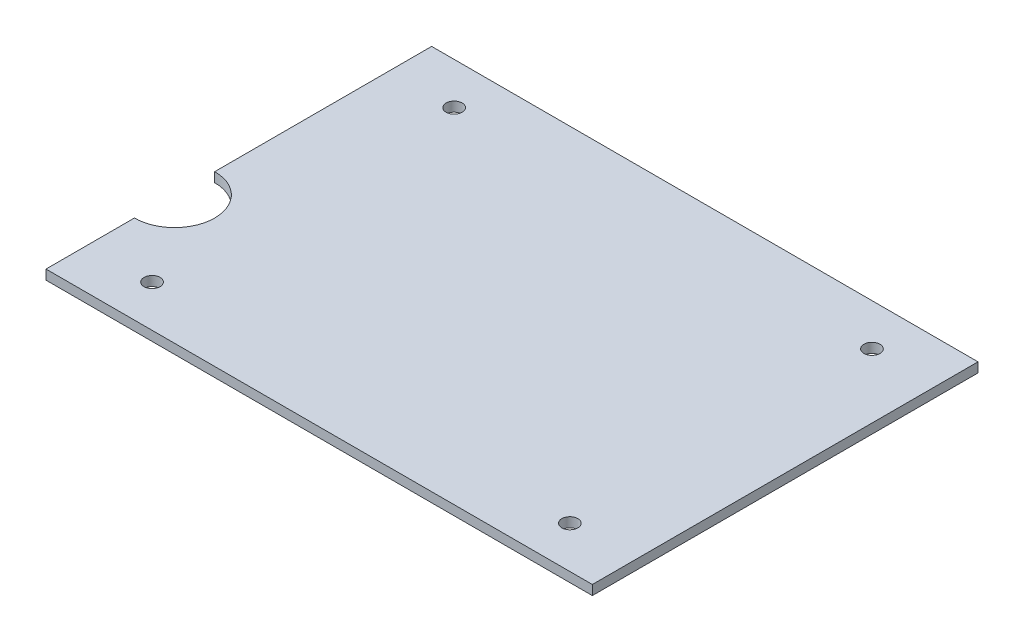
ISO-10303-21;
HEADER;
FILE_DESCRIPTION(('STEP AP214'),'2;1');
FILE_NAME('part.step','',(''),(''),'','','');
FILE_SCHEMA(('AUTOMOTIVE_DESIGN { 1 0 10303 214 1 1 1 1 }'));
ENDSEC;
DATA;
#1=APPLICATION_CONTEXT('core data for automotive mechanical design processes');
#2=APPLICATION_PROTOCOL_DEFINITION('international standard','automotive_design',2000,#1);
#3=PRODUCT_CONTEXT('',#1,'mechanical');
#4=PRODUCT('Part','Part','',(#3));
#5=PRODUCT_RELATED_PRODUCT_CATEGORY('part','',(#4));
#6=PRODUCT_DEFINITION_FORMATION('','',#4);
#7=PRODUCT_DEFINITION_CONTEXT('part definition',#1,'design');
#8=PRODUCT_DEFINITION('design','',#6,#7);
#9=PRODUCT_DEFINITION_SHAPE('','',#8);
#10=(LENGTH_UNIT() NAMED_UNIT(*) SI_UNIT(.MILLI.,.METRE.));
#11=(NAMED_UNIT(*) PLANE_ANGLE_UNIT() SI_UNIT($,.RADIAN.));
#12=(NAMED_UNIT(*) SI_UNIT($,.STERADIAN.) SOLID_ANGLE_UNIT());
#13=UNCERTAINTY_MEASURE_WITH_UNIT(LENGTH_MEASURE(1.E-05),#10,'distance_accuracy_value','');
#14=(GEOMETRIC_REPRESENTATION_CONTEXT(3) GLOBAL_UNCERTAINTY_ASSIGNED_CONTEXT((#13)) GLOBAL_UNIT_ASSIGNED_CONTEXT((#10,
#11,#12)) REPRESENTATION_CONTEXT('',''));
#15=CARTESIAN_POINT('',(0.,0.,0.));
#16=DIRECTION('',(0.,0.,1.));
#17=DIRECTION('',(1.,0.,0.));
#18=AXIS2_PLACEMENT_3D('',#15,#16,#17);
#19=CARTESIAN_POINT('',(-85.,3.,60.));
#20=DIRECTION('',(1.,0.,0.));
#21=DIRECTION('',(0.,0.,-1.));
#22=AXIS2_PLACEMENT_3D('',#19,#20,#21);
#23=PLANE('',#22);
#24=DIRECTION('',(0.,0.,1.));
#25=VECTOR('',#24,1.);
#26=CARTESIAN_POINT('',(-85.,0.,60.));
#27=LINE('',#26,#25);
#28=CARTESIAN_POINT('',(-85.,0.,-60.));
#29=VERTEX_POINT('',#28);
#30=CARTESIAN_POINT('',(-85.,0.,7.49999999999988));
#31=VERTEX_POINT('',#30);
#32=EDGE_CURVE('E107',#29,#31,#27,.T.);
#33=ORIENTED_EDGE('',*,*,#32,.T.);
#34=DIRECTION('',(0.,1.,0.));
#35=VECTOR('',#34,1.);
#36=CARTESIAN_POINT('',(-85.,-0.00100000000000013,7.49999999999989));
#37=LINE('',#36,#35);
#38=CARTESIAN_POINT('',(-85.,3.,7.49999999999988));
#39=VERTEX_POINT('',#38);
#40=EDGE_CURVE('E96',#39,#31,#37,.F.);
#41=ORIENTED_EDGE('',*,*,#40,.F.);
#42=DIRECTION('',(0.,0.,1.));
#43=VECTOR('',#42,1.);
#44=CARTESIAN_POINT('',(-85.,3.,60.));
#45=LINE('',#44,#43);
#46=CARTESIAN_POINT('',(-85.,3.,-60.));
#47=VERTEX_POINT('',#46);
#48=EDGE_CURVE('E105',#47,#39,#45,.T.);
#49=ORIENTED_EDGE('',*,*,#48,.F.);
#50=DIRECTION('',(0.,-1.,0.));
#51=VECTOR('',#50,1.);
#52=CARTESIAN_POINT('',(-85.,3.,-60.));
#53=LINE('',#52,#51);
#54=EDGE_CURVE('E41',#47,#29,#53,.T.);
#55=ORIENTED_EDGE('',*,*,#54,.T.);
#56=EDGE_LOOP('',(#33,#41,#49,#55));
#57=FACE_BOUND('',#56,.T.);
#58=ADVANCED_FACE('F33',(#57),#23,.F.);
#59=CARTESIAN_POINT('',(0.,3.,0.));
#60=DIRECTION('',(0.,-1.,0.));
#61=DIRECTION('',(0.,0.,-1.));
#62=AXIS2_PLACEMENT_3D('',#59,#60,#61);
#63=PLANE('',#62);
#64=ORIENTED_EDGE('',*,*,#48,.T.);
#65=CARTESIAN_POINT('',(-85.,3.,19.9999999999999));
#66=DIRECTION('',(0.,1.,0.));
#67=DIRECTION('',(0.,0.,1.));
#68=AXIS2_PLACEMENT_3D('',#65,#66,#67);
#69=CIRCLE('',#68,12.5);
#70=CARTESIAN_POINT('',(-85.,3.,32.4999999999999));
#71=VERTEX_POINT('',#70);
#72=EDGE_CURVE('E93',#71,#39,#69,.T.);
#73=ORIENTED_EDGE('',*,*,#72,.F.);
#74=CARTESIAN_POINT('',(-85.,3.,60.));
#75=VERTEX_POINT('',#74);
#76=EDGE_CURVE('E111',#71,#75,#45,.T.);
#77=ORIENTED_EDGE('',*,*,#76,.T.);
#78=DIRECTION('',(1.,0.,0.));
#79=VECTOR('',#78,1.);
#80=CARTESIAN_POINT('',(-85.,3.,60.));
#81=LINE('',#80,#79);
#82=CARTESIAN_POINT('',(85.,3.,60.));
#83=VERTEX_POINT('',#82);
#84=EDGE_CURVE('E57',#75,#83,#81,.T.);
#85=ORIENTED_EDGE('',*,*,#84,.T.);
#86=DIRECTION('',(0.,0.,-1.));
#87=VECTOR('',#86,1.);
#88=CARTESIAN_POINT('',(85.,3.,60.));
#89=LINE('',#88,#87);
#90=CARTESIAN_POINT('',(85.,3.,-60.));
#91=VERTEX_POINT('',#90);
#92=EDGE_CURVE('E127',#83,#91,#89,.T.);
#93=ORIENTED_EDGE('',*,*,#92,.T.);
#94=DIRECTION('',(-1.,0.,0.));
#95=VECTOR('',#94,1.);
#96=CARTESIAN_POINT('',(-85.,3.,-60.));
#97=LINE('',#96,#95);
#98=EDGE_CURVE('E85',#91,#47,#97,.T.);
#99=ORIENTED_EDGE('',*,*,#98,.T.);
#100=EDGE_LOOP('',(#64,#73,#77,#85,#93,#99));
#101=FACE_BOUND('',#100,.T.);
#102=CARTESIAN_POINT('',(-65.,3.,-47.));
#103=DIRECTION('',(0.,1.,0.));
#104=DIRECTION('',(0.,0.,1.));
#105=AXIS2_PLACEMENT_3D('',#102,#103,#104);
#106=CIRCLE('',#105,2.5);
#107=CARTESIAN_POINT('',(-65.,3.,-44.5));
#108=VERTEX_POINT('',#107);
#109=EDGE_CURVE('E122',#108,#108,#106,.T.);
#110=ORIENTED_EDGE('',*,*,#109,.F.);
#111=EDGE_LOOP('',(#110));
#112=FACE_BOUND('',#111,.T.);
#113=CARTESIAN_POINT('',(-65.,3.,47.));
#114=DIRECTION('',(0.,1.,0.));
#115=DIRECTION('',(0.,0.,-1.));
#116=AXIS2_PLACEMENT_3D('',#113,#114,#115);
#117=CIRCLE('',#116,2.5);
#118=CARTESIAN_POINT('',(-65.,3.,44.5));
#119=VERTEX_POINT('',#118);
#120=EDGE_CURVE('E150',#119,#119,#117,.T.);
#121=ORIENTED_EDGE('',*,*,#120,.F.);
#122=EDGE_LOOP('',(#121));
#123=FACE_BOUND('',#122,.T.);
#124=CARTESIAN_POINT('',(65.,3.,47.));
#125=DIRECTION('',(0.,1.,0.));
#126=DIRECTION('',(0.,0.,1.));
#127=AXIS2_PLACEMENT_3D('',#124,#125,#126);
#128=CIRCLE('',#127,2.5);
#129=CARTESIAN_POINT('',(65.,3.,49.5));
#130=VERTEX_POINT('',#129);
#131=EDGE_CURVE('E144',#130,#130,#128,.T.);
#132=ORIENTED_EDGE('',*,*,#131,.F.);
#133=EDGE_LOOP('',(#132));
#134=FACE_BOUND('',#133,.T.);
#135=CARTESIAN_POINT('',(65.,3.,-47.));
#136=DIRECTION('',(0.,1.,0.));
#137=DIRECTION('',(0.,0.,-1.));
#138=AXIS2_PLACEMENT_3D('',#135,#136,#137);
#139=CIRCLE('',#138,2.5);
#140=CARTESIAN_POINT('',(65.,3.,-49.5));
#141=VERTEX_POINT('',#140);
#142=EDGE_CURVE('E138',#141,#141,#139,.T.);
#143=ORIENTED_EDGE('',*,*,#142,.F.);
#144=EDGE_LOOP('',(#143));
#145=FACE_BOUND('',#144,.T.);
#146=ADVANCED_FACE('F109',(#101,#112,#123,#134,#145),#63,.F.);
#147=CARTESIAN_POINT('',(0.,0.,0.));
#148=DIRECTION('',(0.,-1.,0.));
#149=DIRECTION('',(0.,0.,-1.));
#150=AXIS2_PLACEMENT_3D('',#147,#148,#149);
#151=PLANE('',#150);
#152=CARTESIAN_POINT('',(-85.,0.,19.9999999999999));
#153=DIRECTION('',(0.,-1.,0.));
#154=DIRECTION('',(0.,0.,-1.));
#155=AXIS2_PLACEMENT_3D('',#152,#153,#154);
#156=CIRCLE('',#155,12.5);
#157=CARTESIAN_POINT('',(-85.,0.,32.4999999999999));
#158=VERTEX_POINT('',#157);
#159=EDGE_CURVE('E48',#158,#31,#156,.F.);
#160=ORIENTED_EDGE('',*,*,#159,.T.);
#161=ORIENTED_EDGE('',*,*,#32,.F.);
#162=DIRECTION('',(-1.,0.,0.));
#163=VECTOR('',#162,1.);
#164=CARTESIAN_POINT('',(-85.,0.,-60.));
#165=LINE('',#164,#163);
#166=CARTESIAN_POINT('',(85.,0.,-60.));
#167=VERTEX_POINT('',#166);
#168=EDGE_CURVE('E121',#167,#29,#165,.T.);
#169=ORIENTED_EDGE('',*,*,#168,.F.);
#170=DIRECTION('',(0.,0.,-1.));
#171=VECTOR('',#170,1.);
#172=CARTESIAN_POINT('',(85.,0.,60.));
#173=LINE('',#172,#171);
#174=CARTESIAN_POINT('',(85.,0.,60.));
#175=VERTEX_POINT('',#174);
#176=EDGE_CURVE('E118',#175,#167,#173,.T.);
#177=ORIENTED_EDGE('',*,*,#176,.F.);
#178=DIRECTION('',(1.,0.,0.));
#179=VECTOR('',#178,1.);
#180=CARTESIAN_POINT('',(-85.,0.,60.));
#181=LINE('',#180,#179);
#182=CARTESIAN_POINT('',(-85.,0.,60.));
#183=VERTEX_POINT('',#182);
#184=EDGE_CURVE('E78',#183,#175,#181,.T.);
#185=ORIENTED_EDGE('',*,*,#184,.F.);
#186=EDGE_CURVE('E124',#158,#183,#27,.T.);
#187=ORIENTED_EDGE('',*,*,#186,.F.);
#188=EDGE_LOOP('',(#160,#161,#169,#177,#185,#187));
#189=FACE_BOUND('',#188,.T.);
#190=CARTESIAN_POINT('',(65.,0.,47.));
#191=DIRECTION('',(0.,1.,0.));
#192=DIRECTION('',(0.,0.,1.));
#193=AXIS2_PLACEMENT_3D('',#190,#191,#192);
#194=CIRCLE('',#193,2.5);
#195=CARTESIAN_POINT('',(65.,0.,49.5));
#196=VERTEX_POINT('',#195);
#197=EDGE_CURVE('E142',#196,#196,#194,.T.);
#198=ORIENTED_EDGE('',*,*,#197,.T.);
#199=EDGE_LOOP('',(#198));
#200=FACE_BOUND('',#199,.T.);
#201=CARTESIAN_POINT('',(-65.,0.,-47.));
#202=DIRECTION('',(0.,1.,0.));
#203=DIRECTION('',(0.,0.,1.));
#204=AXIS2_PLACEMENT_3D('',#201,#202,#203);
#205=CIRCLE('',#204,2.5);
#206=CARTESIAN_POINT('',(-65.,0.,-44.5));
#207=VERTEX_POINT('',#206);
#208=EDGE_CURVE('E153',#207,#207,#205,.T.);
#209=ORIENTED_EDGE('',*,*,#208,.T.);
#210=EDGE_LOOP('',(#209));
#211=FACE_BOUND('',#210,.T.);
#212=CARTESIAN_POINT('',(-65.,0.,47.));
#213=DIRECTION('',(0.,1.,0.));
#214=DIRECTION('',(0.,0.,-1.));
#215=AXIS2_PLACEMENT_3D('',#212,#213,#214);
#216=CIRCLE('',#215,2.5);
#217=CARTESIAN_POINT('',(-65.,0.,44.5));
#218=VERTEX_POINT('',#217);
#219=EDGE_CURVE('E147',#218,#218,#216,.T.);
#220=ORIENTED_EDGE('',*,*,#219,.T.);
#221=EDGE_LOOP('',(#220));
#222=FACE_BOUND('',#221,.T.);
#223=CARTESIAN_POINT('',(65.,0.,-47.));
#224=DIRECTION('',(0.,1.,0.));
#225=DIRECTION('',(0.,0.,-1.));
#226=AXIS2_PLACEMENT_3D('',#223,#224,#225);
#227=CIRCLE('',#226,2.5);
#228=CARTESIAN_POINT('',(65.,0.,-49.5));
#229=VERTEX_POINT('',#228);
#230=EDGE_CURVE('E135',#229,#229,#227,.T.);
#231=ORIENTED_EDGE('',*,*,#230,.T.);
#232=EDGE_LOOP('',(#231));
#233=FACE_BOUND('',#232,.T.);
#234=ADVANCED_FACE('F131',(#189,#200,#211,#222,#233),#151,.T.);
#235=CARTESIAN_POINT('',(85.,3.,60.));
#236=DIRECTION('',(-1.,0.,0.));
#237=DIRECTION('',(0.,0.,1.));
#238=AXIS2_PLACEMENT_3D('',#235,#236,#237);
#239=PLANE('',#238);
#240=ORIENTED_EDGE('',*,*,#176,.T.);
#241=DIRECTION('',(0.,-1.,0.));
#242=VECTOR('',#241,1.);
#243=CARTESIAN_POINT('',(85.,3.,-60.));
#244=LINE('',#243,#242);
#245=EDGE_CURVE('E11',#91,#167,#244,.T.);
#246=ORIENTED_EDGE('',*,*,#245,.F.);
#247=ORIENTED_EDGE('',*,*,#92,.F.);
#248=DIRECTION('',(0.,-1.,0.));
#249=VECTOR('',#248,1.);
#250=CARTESIAN_POINT('',(85.,3.,60.));
#251=LINE('',#250,#249);
#252=EDGE_CURVE('E113',#83,#175,#251,.T.);
#253=ORIENTED_EDGE('',*,*,#252,.T.);
#254=EDGE_LOOP('',(#240,#246,#247,#253));
#255=FACE_BOUND('',#254,.T.);
#256=ADVANCED_FACE('F35',(#255),#239,.F.);
#257=CARTESIAN_POINT('',(-85.,3.,-60.));
#258=DIRECTION('',(0.,0.,1.));
#259=DIRECTION('',(1.,0.,0.));
#260=AXIS2_PLACEMENT_3D('',#257,#258,#259);
#261=PLANE('',#260);
#262=ORIENTED_EDGE('',*,*,#168,.T.);
#263=ORIENTED_EDGE('',*,*,#54,.F.);
#264=ORIENTED_EDGE('',*,*,#98,.F.);
#265=ORIENTED_EDGE('',*,*,#245,.T.);
#266=EDGE_LOOP('',(#262,#263,#264,#265));
#267=FACE_BOUND('',#266,.T.);
#268=ADVANCED_FACE('F162',(#267),#261,.F.);
#269=ORIENTED_EDGE('',*,*,#76,.F.);
#270=DIRECTION('',(0.,1.,0.));
#271=VECTOR('',#270,1.);
#272=CARTESIAN_POINT('',(-85.,-0.00100000000000013,32.4999999999999));
#273=LINE('',#272,#271);
#274=EDGE_CURVE('E97',#158,#71,#273,.T.);
#275=ORIENTED_EDGE('',*,*,#274,.F.);
#276=ORIENTED_EDGE('',*,*,#186,.T.);
#277=DIRECTION('',(0.,-1.,0.));
#278=VECTOR('',#277,1.);
#279=CARTESIAN_POINT('',(-85.,3.,60.));
#280=LINE('',#279,#278);
#281=EDGE_CURVE('E129',#75,#183,#280,.T.);
#282=ORIENTED_EDGE('',*,*,#281,.F.);
#283=EDGE_LOOP('',(#269,#275,#276,#282));
#284=FACE_BOUND('',#283,.T.);
#285=ADVANCED_FACE('F164',(#284),#23,.F.);
#286=CARTESIAN_POINT('',(-85.,3.,60.));
#287=DIRECTION('',(0.,0.,-1.));
#288=DIRECTION('',(-1.,0.,0.));
#289=AXIS2_PLACEMENT_3D('',#286,#287,#288);
#290=PLANE('',#289);
#291=ORIENTED_EDGE('',*,*,#184,.T.);
#292=ORIENTED_EDGE('',*,*,#252,.F.);
#293=ORIENTED_EDGE('',*,*,#84,.F.);
#294=ORIENTED_EDGE('',*,*,#281,.T.);
#295=EDGE_LOOP('',(#291,#292,#293,#294));
#296=FACE_BOUND('',#295,.T.);
#297=ADVANCED_FACE('F169',(#296),#290,.F.);
#298=CARTESIAN_POINT('',(-65.,3.,-47.));
#299=DIRECTION('',(0.,-1.,0.));
#300=DIRECTION('',(0.,0.,-1.));
#301=AXIS2_PLACEMENT_3D('',#298,#299,#300);
#302=CYLINDRICAL_SURFACE('',#301,2.5);
#303=ORIENTED_EDGE('',*,*,#109,.T.);
#304=EDGE_LOOP('',(#303));
#305=FACE_BOUND('',#304,.T.);
#306=ORIENTED_EDGE('',*,*,#208,.F.);
#307=EDGE_LOOP('',(#306));
#308=FACE_BOUND('',#307,.T.);
#309=ADVANCED_FACE('F180',(#305,#308),#302,.F.);
#310=CARTESIAN_POINT('',(-65.,3.,47.));
#311=DIRECTION('',(0.,-1.,0.));
#312=DIRECTION('',(0.,0.,-1.));
#313=AXIS2_PLACEMENT_3D('',#310,#311,#312);
#314=CYLINDRICAL_SURFACE('',#313,2.5);
#315=ORIENTED_EDGE('',*,*,#120,.T.);
#316=EDGE_LOOP('',(#315));
#317=FACE_BOUND('',#316,.T.);
#318=ORIENTED_EDGE('',*,*,#219,.F.);
#319=EDGE_LOOP('',(#318));
#320=FACE_BOUND('',#319,.T.);
#321=ADVANCED_FACE('F185',(#317,#320),#314,.F.);
#322=CARTESIAN_POINT('',(65.,3.,47.));
#323=DIRECTION('',(0.,-1.,0.));
#324=DIRECTION('',(0.,0.,-1.));
#325=AXIS2_PLACEMENT_3D('',#322,#323,#324);
#326=CYLINDRICAL_SURFACE('',#325,2.5);
#327=ORIENTED_EDGE('',*,*,#131,.T.);
#328=EDGE_LOOP('',(#327));
#329=FACE_BOUND('',#328,.T.);
#330=ORIENTED_EDGE('',*,*,#197,.F.);
#331=EDGE_LOOP('',(#330));
#332=FACE_BOUND('',#331,.T.);
#333=ADVANCED_FACE('F189',(#329,#332),#326,.F.);
#334=CARTESIAN_POINT('',(65.,3.,-47.));
#335=DIRECTION('',(0.,-1.,0.));
#336=DIRECTION('',(0.,0.,-1.));
#337=AXIS2_PLACEMENT_3D('',#334,#335,#336);
#338=CYLINDRICAL_SURFACE('',#337,2.5);
#339=ORIENTED_EDGE('',*,*,#142,.T.);
#340=EDGE_LOOP('',(#339));
#341=FACE_BOUND('',#340,.T.);
#342=ORIENTED_EDGE('',*,*,#230,.F.);
#343=EDGE_LOOP('',(#342));
#344=FACE_BOUND('',#343,.T.);
#345=ADVANCED_FACE('F193',(#341,#344),#338,.F.);
#346=CARTESIAN_POINT('',(-85.,-0.00100000000000013,19.9999999999999));
#347=DIRECTION('',(0.,1.,0.));
#348=DIRECTION('',(0.,0.,1.));
#349=AXIS2_PLACEMENT_3D('',#346,#347,#348);
#350=CYLINDRICAL_SURFACE('',#349,12.5);
#351=ORIENTED_EDGE('',*,*,#40,.T.);
#352=ORIENTED_EDGE('',*,*,#159,.F.);
#353=ORIENTED_EDGE('',*,*,#274,.T.);
#354=ORIENTED_EDGE('',*,*,#72,.T.);
#355=EDGE_LOOP('',(#351,#352,#353,#354));
#356=FACE_BOUND('',#355,.T.);
#357=ADVANCED_FACE('F95',(#356),#350,.F.);
#358=CLOSED_SHELL('',(#58,#146,#234,#256,#268,#285,#297,#309,#321,#333,#345,#357));
#359=MANIFOLD_SOLID_BREP('B2',#358);
#360=ADVANCED_BREP_SHAPE_REPRESENTATION('',(#18,#359),#14);
#361=SHAPE_DEFINITION_REPRESENTATION(#9,#360);
ENDSEC;
END-ISO-10303-21;
